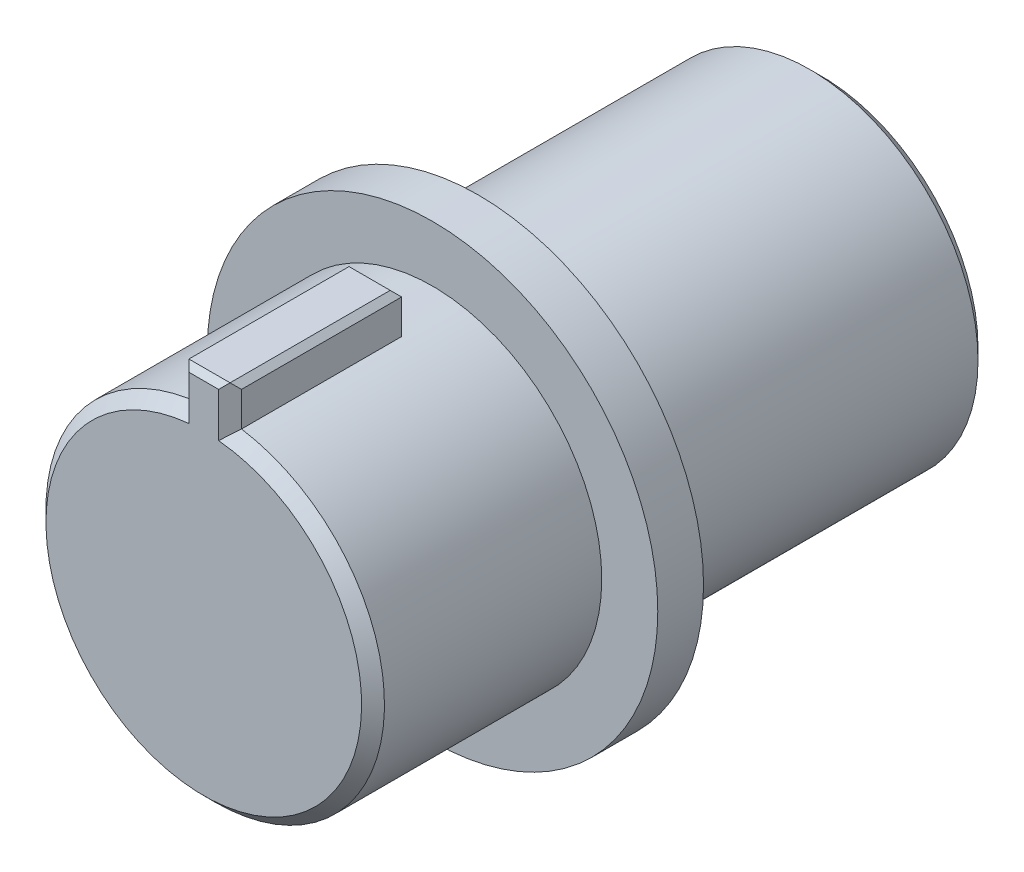
ISO-10303-21;
HEADER;
FILE_DESCRIPTION(('STEP AP214'),'2;1');
FILE_NAME('part.step','',(''),(''),'','','');
FILE_SCHEMA(('AUTOMOTIVE_DESIGN { 1 0 10303 214 1 1 1 1 }'));
ENDSEC;
DATA;
#1=APPLICATION_CONTEXT('core data for automotive mechanical design processes');
#2=APPLICATION_PROTOCOL_DEFINITION('international standard','automotive_design',2000,#1);
#3=PRODUCT_CONTEXT('',#1,'mechanical');
#4=PRODUCT('Part','Part','',(#3));
#5=PRODUCT_RELATED_PRODUCT_CATEGORY('part','',(#4));
#6=PRODUCT_DEFINITION_FORMATION('','',#4);
#7=PRODUCT_DEFINITION_CONTEXT('part definition',#1,'design');
#8=PRODUCT_DEFINITION('design','',#6,#7);
#9=PRODUCT_DEFINITION_SHAPE('','',#8);
#10=(LENGTH_UNIT() NAMED_UNIT(*) SI_UNIT(.MILLI.,.METRE.));
#11=(NAMED_UNIT(*) PLANE_ANGLE_UNIT() SI_UNIT($,.RADIAN.));
#12=(NAMED_UNIT(*) SI_UNIT($,.STERADIAN.) SOLID_ANGLE_UNIT());
#13=UNCERTAINTY_MEASURE_WITH_UNIT(LENGTH_MEASURE(1.E-05),#10,'distance_accuracy_value','');
#14=(GEOMETRIC_REPRESENTATION_CONTEXT(3) GLOBAL_UNCERTAINTY_ASSIGNED_CONTEXT((#13)) GLOBAL_UNIT_ASSIGNED_CONTEXT((#10,
#11,#12)) REPRESENTATION_CONTEXT('',''));
#15=CARTESIAN_POINT('',(0.,0.,0.));
#16=DIRECTION('',(0.,0.,1.));
#17=DIRECTION('',(1.,0.,0.));
#18=AXIS2_PLACEMENT_3D('',#15,#16,#17);
#19=CARTESIAN_POINT('',(-49.9999999999998,10.3000000000004,-30.));
#20=DIRECTION('',(0.,0.,1.));
#21=DIRECTION('',(1.,0.,0.));
#22=AXIS2_PLACEMENT_3D('',#19,#20,#21);
#23=CYLINDRICAL_SURFACE('',#22,14.7);
#24=CARTESIAN_POINT('',(-49.9999999999998,10.3000000000004,-29.));
#25=DIRECTION('',(0.,0.,1.));
#26=DIRECTION('',(1.,0.,0.));
#27=AXIS2_PLACEMENT_3D('',#24,#25,#26);
#28=CIRCLE('',#27,14.7);
#29=CARTESIAN_POINT('',(-35.2999999999998,10.3000000000004,-29.));
#30=VERTEX_POINT('',#29);
#31=EDGE_CURVE('E56',#30,#30,#28,.T.);
#32=ORIENTED_EDGE('',*,*,#31,.T.);
#33=EDGE_LOOP('',(#32));
#34=FACE_BOUND('',#33,.T.);
#35=CARTESIAN_POINT('',(-49.9999999999998,10.3000000000004,0.));
#36=DIRECTION('',(0.,0.,1.));
#37=DIRECTION('',(1.,0.,0.));
#38=AXIS2_PLACEMENT_3D('',#35,#36,#37);
#39=CIRCLE('',#38,14.7);
#40=CARTESIAN_POINT('',(-35.2999999999998,10.3000000000004,0.));
#41=VERTEX_POINT('',#40);
#42=EDGE_CURVE('E157',#41,#41,#39,.T.);
#43=ORIENTED_EDGE('',*,*,#42,.F.);
#44=EDGE_LOOP('',(#43));
#45=FACE_BOUND('',#44,.T.);
#46=ADVANCED_FACE('F40',(#34,#45),#23,.T.);
#47=CARTESIAN_POINT('',(-49.9999999999998,10.3000000000004,-30.));
#48=DIRECTION('',(0.,0.,1.));
#49=DIRECTION('',(1.,0.,0.));
#50=AXIS2_PLACEMENT_3D('',#47,#48,#49);
#51=PLANE('',#50);
#52=CARTESIAN_POINT('',(-49.9999999999998,10.3000000000004,-30.));
#53=DIRECTION('',(0.,0.,1.));
#54=DIRECTION('',(1.,0.,0.));
#55=AXIS2_PLACEMENT_3D('',#52,#53,#54);
#56=CIRCLE('',#55,13.7);
#57=CARTESIAN_POINT('',(-36.2999999999998,10.3000000000004,-30.));
#58=VERTEX_POINT('',#57);
#59=EDGE_CURVE('E11',#58,#58,#56,.F.);
#60=ORIENTED_EDGE('',*,*,#59,.T.);
#61=EDGE_LOOP('',(#60));
#62=FACE_BOUND('',#61,.T.);
#63=ADVANCED_FACE('F264',(#62),#51,.F.);
#64=CARTESIAN_POINT('',(-49.9999999999998,10.3000000000004,4.));
#65=DIRECTION('',(0.,0.,-1.));
#66=DIRECTION('',(-1.,0.,0.));
#67=AXIS2_PLACEMENT_3D('',#64,#65,#66);
#68=CYLINDRICAL_SURFACE('',#67,19.7);
#69=CARTESIAN_POINT('',(-49.9999999999998,10.3000000000004,4.));
#70=DIRECTION('',(0.,0.,1.));
#71=DIRECTION('',(1.,0.,0.));
#72=AXIS2_PLACEMENT_3D('',#69,#70,#71);
#73=CIRCLE('',#72,19.7);
#74=CARTESIAN_POINT('',(-30.2999999999998,10.3000000000004,4.));
#75=VERTEX_POINT('',#74);
#76=EDGE_CURVE('E158',#75,#75,#73,.T.);
#77=ORIENTED_EDGE('',*,*,#76,.F.);
#78=EDGE_LOOP('',(#77));
#79=FACE_BOUND('',#78,.T.);
#80=CARTESIAN_POINT('',(-49.9999999999998,10.3000000000004,0.));
#81=DIRECTION('',(0.,0.,1.));
#82=DIRECTION('',(1.,0.,0.));
#83=AXIS2_PLACEMENT_3D('',#80,#81,#82);
#84=CIRCLE('',#83,19.7);
#85=CARTESIAN_POINT('',(-30.2999999999998,10.3000000000004,0.));
#86=VERTEX_POINT('',#85);
#87=EDGE_CURVE('E150',#86,#86,#84,.T.);
#88=ORIENTED_EDGE('',*,*,#87,.T.);
#89=EDGE_LOOP('',(#88));
#90=FACE_BOUND('',#89,.T.);
#91=ADVANCED_FACE('F271',(#79,#90),#68,.T.);
#92=CARTESIAN_POINT('',(-49.9999999999998,10.3000000000004,4.));
#93=DIRECTION('',(0.,0.,1.));
#94=DIRECTION('',(1.,0.,0.));
#95=AXIS2_PLACEMENT_3D('',#92,#93,#94);
#96=PLANE('',#95);
#97=CARTESIAN_POINT('',(-49.9999999999998,10.3000000000004,4.));
#98=DIRECTION('',(0.,0.,1.));
#99=DIRECTION('',(1.,0.,0.));
#100=AXIS2_PLACEMENT_3D('',#97,#98,#99);
#101=CIRCLE('',#100,14.8);
#102=CARTESIAN_POINT('',(-35.1999999999998,10.3000000000004,4.));
#103=VERTEX_POINT('',#102);
#104=EDGE_CURVE('E152',#103,#103,#101,.T.);
#105=ORIENTED_EDGE('',*,*,#104,.F.);
#106=EDGE_LOOP('',(#105));
#107=FACE_BOUND('',#106,.T.);
#108=ORIENTED_EDGE('',*,*,#76,.T.);
#109=EDGE_LOOP('',(#108));
#110=FACE_BOUND('',#109,.T.);
#111=ADVANCED_FACE('F337',(#107,#110),#96,.T.);
#112=CARTESIAN_POINT('',(-49.9999999999998,10.3000000000004,0.));
#113=DIRECTION('',(0.,0.,1.));
#114=DIRECTION('',(1.,0.,0.));
#115=AXIS2_PLACEMENT_3D('',#112,#113,#114);
#116=PLANE('',#115);
#117=ORIENTED_EDGE('',*,*,#42,.T.);
#118=EDGE_LOOP('',(#117));
#119=FACE_BOUND('',#118,.T.);
#120=ORIENTED_EDGE('',*,*,#87,.F.);
#121=EDGE_LOOP('',(#120));
#122=FACE_BOUND('',#121,.T.);
#123=ADVANCED_FACE('F336',(#119,#122),#116,.F.);
#124=CARTESIAN_POINT('',(-49.9999999999998,10.3000000000004,24.));
#125=DIRECTION('',(0.,0.,-1.));
#126=DIRECTION('',(-1.,0.,0.));
#127=AXIS2_PLACEMENT_3D('',#124,#125,#126);
#128=CYLINDRICAL_SURFACE('',#127,14.8);
#129=DIRECTION('',(0.,0.,1.));
#130=VECTOR('',#129,1.);
#131=CARTESIAN_POINT('',(-47.6999999999998,24.9201915172138,9.));
#132=LINE('',#131,#130);
#133=CARTESIAN_POINT('',(-47.6999999999998,24.9201915172138,9.));
#134=VERTEX_POINT('',#133);
#135=CARTESIAN_POINT('',(-47.6999999999998,24.9201915172138,23.));
#136=VERTEX_POINT('',#135);
#137=EDGE_CURVE('E115',#134,#136,#132,.T.);
#138=ORIENTED_EDGE('',*,*,#137,.T.);
#139=CARTESIAN_POINT('',(-49.9999999999998,10.3000000000004,23.));
#140=DIRECTION('',(0.,0.,1.));
#141=DIRECTION('',(1.,0.,0.));
#142=AXIS2_PLACEMENT_3D('',#139,#140,#141);
#143=CIRCLE('',#142,14.8);
#144=CARTESIAN_POINT('',(-52.2999999999998,24.9201915172138,23.));
#145=VERTEX_POINT('',#144);
#146=EDGE_CURVE('E64',#136,#145,#143,.F.);
#147=ORIENTED_EDGE('',*,*,#146,.T.);
#148=DIRECTION('',(0.,0.,1.));
#149=VECTOR('',#148,1.);
#150=CARTESIAN_POINT('',(-52.2999999999998,24.9201915172138,9.));
#151=LINE('',#150,#149);
#152=CARTESIAN_POINT('',(-52.2999999999998,24.9201915172138,9.));
#153=VERTEX_POINT('',#152);
#154=EDGE_CURVE('E125',#153,#145,#151,.T.);
#155=ORIENTED_EDGE('',*,*,#154,.F.);
#156=CARTESIAN_POINT('',(-49.9999999999998,10.3000000000004,9.));
#157=DIRECTION('',(0.,0.,-1.));
#158=DIRECTION('',(1.,0.,0.));
#159=AXIS2_PLACEMENT_3D('',#156,#157,#158);
#160=CIRCLE('',#159,14.8);
#161=EDGE_CURVE('E132',#153,#134,#160,.T.);
#162=ORIENTED_EDGE('',*,*,#161,.T.);
#163=EDGE_LOOP('',(#138,#147,#155,#162));
#164=FACE_BOUND('',#163,.T.);
#165=ORIENTED_EDGE('',*,*,#104,.T.);
#166=EDGE_LOOP('',(#165));
#167=FACE_BOUND('',#166,.T.);
#168=ADVANCED_FACE('F137',(#164,#167),#128,.T.);
#169=CARTESIAN_POINT('',(-49.9999999999998,10.3000000000004,24.));
#170=DIRECTION('',(0.,0.,1.));
#171=DIRECTION('',(1.,0.,0.));
#172=AXIS2_PLACEMENT_3D('',#169,#170,#171);
#173=PLANE('',#172);
#174=CARTESIAN_POINT('',(-49.9999999999998,10.3000000000004,24.));
#175=DIRECTION('',(0.,0.,1.));
#176=DIRECTION('',(1.,0.,0.));
#177=AXIS2_PLACEMENT_3D('',#174,#175,#176);
#178=CIRCLE('',#177,13.8);
#179=CARTESIAN_POINT('',(-51.2999999999998,24.0386316640345,24.));
#180=VERTEX_POINT('',#179);
#181=CARTESIAN_POINT('',(-48.6999999999998,24.0386316640345,24.));
#182=VERTEX_POINT('',#181);
#183=EDGE_CURVE('E193',#180,#182,#178,.T.);
#184=ORIENTED_EDGE('',*,*,#183,.T.);
#185=DIRECTION('',(0.,1.,0.));
#186=VECTOR('',#185,1.);
#187=CARTESIAN_POINT('',(-48.6999999999998,10.3000000000004,24.));
#188=LINE('',#187,#186);
#189=CARTESIAN_POINT('',(-48.6999999999998,27.9201915172138,24.));
#190=VERTEX_POINT('',#189);
#191=EDGE_CURVE('E202',#182,#190,#188,.T.);
#192=ORIENTED_EDGE('',*,*,#191,.T.);
#193=DIRECTION('',(-1.,0.,0.));
#194=VECTOR('',#193,1.);
#195=CARTESIAN_POINT('',(-49.9999999999998,27.9201915172138,24.));
#196=LINE('',#195,#194);
#197=CARTESIAN_POINT('',(-51.2999999999998,27.9201915172138,24.));
#198=VERTEX_POINT('',#197);
#199=EDGE_CURVE('E189',#190,#198,#196,.T.);
#200=ORIENTED_EDGE('',*,*,#199,.T.);
#201=DIRECTION('',(0.,-1.,0.));
#202=VECTOR('',#201,1.);
#203=CARTESIAN_POINT('',(-51.2999999999998,10.3000000000004,24.));
#204=LINE('',#203,#202);
#205=EDGE_CURVE('E199',#198,#180,#204,.T.);
#206=ORIENTED_EDGE('',*,*,#205,.T.);
#207=EDGE_LOOP('',(#184,#192,#200,#206));
#208=FACE_BOUND('',#207,.T.);
#209=ADVANCED_FACE('F323',(#208),#173,.T.);
#210=CARTESIAN_POINT('',(-52.2999999999998,24.9201915172138,9.));
#211=DIRECTION('',(-1.,0.,0.));
#212=DIRECTION('',(0.,0.,1.));
#213=AXIS2_PLACEMENT_3D('',#210,#211,#212);
#214=PLANE('',#213);
#215=ORIENTED_EDGE('',*,*,#154,.T.);
#216=DIRECTION('',(0.,1.,0.));
#217=VECTOR('',#216,1.);
#218=CARTESIAN_POINT('',(-52.2999999999998,24.9201915172138,23.));
#219=LINE('',#218,#217);
#220=CARTESIAN_POINT('',(-52.2999999999998,27.9201915172138,23.));
#221=VERTEX_POINT('',#220);
#222=EDGE_CURVE('E71',#145,#221,#219,.T.);
#223=ORIENTED_EDGE('',*,*,#222,.T.);
#224=DIRECTION('',(0.,0.,-1.));
#225=VECTOR('',#224,1.);
#226=CARTESIAN_POINT('',(-52.2999999999998,27.9201915172138,9.));
#227=LINE('',#226,#225);
#228=CARTESIAN_POINT('',(-52.2999999999998,27.9201915172138,9.));
#229=VERTEX_POINT('',#228);
#230=EDGE_CURVE('E181',#221,#229,#227,.T.);
#231=ORIENTED_EDGE('',*,*,#230,.T.);
#232=DIRECTION('',(0.,-1.,0.));
#233=VECTOR('',#232,1.);
#234=CARTESIAN_POINT('',(-52.2999999999998,24.9201915172138,9.));
#235=LINE('',#234,#233);
#236=EDGE_CURVE('E126',#229,#153,#235,.T.);
#237=ORIENTED_EDGE('',*,*,#236,.T.);
#238=EDGE_LOOP('',(#215,#223,#231,#237));
#239=FACE_BOUND('',#238,.T.);
#240=ADVANCED_FACE('F321',(#239),#214,.T.);
#241=CARTESIAN_POINT('',(-52.2999999999998,28.4201915172138,9.));
#242=DIRECTION('',(0.,1.,0.));
#243=DIRECTION('',(0.,0.,1.));
#244=AXIS2_PLACEMENT_3D('',#241,#242,#243);
#245=PLANE('',#244);
#246=DIRECTION('',(-1.,0.,0.));
#247=VECTOR('',#246,1.);
#248=CARTESIAN_POINT('',(-52.2999999999998,28.4201915172138,9.5));
#249=LINE('',#248,#247);
#250=CARTESIAN_POINT('',(-48.1999999999998,28.4201915172138,9.5));
#251=VERTEX_POINT('',#250);
#252=CARTESIAN_POINT('',(-51.7999999999998,28.4201915172138,9.5));
#253=VERTEX_POINT('',#252);
#254=EDGE_CURVE('E174',#251,#253,#249,.T.);
#255=ORIENTED_EDGE('',*,*,#254,.T.);
#256=DIRECTION('',(0.,0.,1.));
#257=VECTOR('',#256,1.);
#258=CARTESIAN_POINT('',(-51.7999999999998,28.4201915172138,9.));
#259=LINE('',#258,#257);
#260=CARTESIAN_POINT('',(-51.7999999999998,28.4201915172138,23.5));
#261=VERTEX_POINT('',#260);
#262=EDGE_CURVE('E177',#253,#261,#259,.T.);
#263=ORIENTED_EDGE('',*,*,#262,.T.);
#264=DIRECTION('',(1.,0.,0.));
#265=VECTOR('',#264,1.);
#266=CARTESIAN_POINT('',(-52.2999999999998,28.4201915172138,23.5));
#267=LINE('',#266,#265);
#268=CARTESIAN_POINT('',(-48.1999999999998,28.4201915172138,23.5));
#269=VERTEX_POINT('',#268);
#270=EDGE_CURVE('E156',#261,#269,#267,.T.);
#271=ORIENTED_EDGE('',*,*,#270,.T.);
#272=DIRECTION('',(0.,0.,-1.));
#273=VECTOR('',#272,1.);
#274=CARTESIAN_POINT('',(-48.1999999999998,28.4201915172138,9.));
#275=LINE('',#274,#273);
#276=EDGE_CURVE('E171',#269,#251,#275,.T.);
#277=ORIENTED_EDGE('',*,*,#276,.T.);
#278=EDGE_LOOP('',(#255,#263,#271,#277));
#279=FACE_BOUND('',#278,.T.);
#280=ADVANCED_FACE('F319',(#279),#245,.T.);
#281=CARTESIAN_POINT('',(-47.6999999999998,24.9201915172138,9.));
#282=DIRECTION('',(1.,0.,0.));
#283=DIRECTION('',(0.,1.,0.));
#284=AXIS2_PLACEMENT_3D('',#281,#282,#283);
#285=PLANE('',#284);
#286=DIRECTION('',(0.,0.,1.));
#287=VECTOR('',#286,1.);
#288=CARTESIAN_POINT('',(-47.6999999999998,27.9201915172138,9.));
#289=LINE('',#288,#287);
#290=CARTESIAN_POINT('',(-47.6999999999998,27.9201915172138,9.));
#291=VERTEX_POINT('',#290);
#292=CARTESIAN_POINT('',(-47.6999999999998,27.9201915172138,23.));
#293=VERTEX_POINT('',#292);
#294=EDGE_CURVE('E186',#291,#293,#289,.T.);
#295=ORIENTED_EDGE('',*,*,#294,.T.);
#296=DIRECTION('',(0.,-1.,0.));
#297=VECTOR('',#296,1.);
#298=CARTESIAN_POINT('',(-47.6999999999998,24.9201915172138,23.));
#299=LINE('',#298,#297);
#300=EDGE_CURVE('E122',#293,#136,#299,.T.);
#301=ORIENTED_EDGE('',*,*,#300,.T.);
#302=ORIENTED_EDGE('',*,*,#137,.F.);
#303=DIRECTION('',(0.,1.,0.));
#304=VECTOR('',#303,1.);
#305=CARTESIAN_POINT('',(-47.6999999999998,24.9201915172138,9.));
#306=LINE('',#305,#304);
#307=EDGE_CURVE('E119',#134,#291,#306,.T.);
#308=ORIENTED_EDGE('',*,*,#307,.T.);
#309=EDGE_LOOP('',(#295,#301,#302,#308));
#310=FACE_BOUND('',#309,.T.);
#311=ADVANCED_FACE('F118',(#310),#285,.T.);
#312=CARTESIAN_POINT('',(-49.9999999999998,10.3000000000004,9.));
#313=DIRECTION('',(0.,0.,1.));
#314=DIRECTION('',(1.,0.,0.));
#315=AXIS2_PLACEMENT_3D('',#312,#313,#314);
#316=PLANE('',#315);
#317=ORIENTED_EDGE('',*,*,#236,.F.);
#318=DIRECTION('',(1.,0.,0.));
#319=VECTOR('',#318,1.);
#320=CARTESIAN_POINT('',(-47.6999999999998,27.9201915172138,9.));
#321=LINE('',#320,#319);
#322=EDGE_CURVE('E134',#229,#291,#321,.T.);
#323=ORIENTED_EDGE('',*,*,#322,.T.);
#324=ORIENTED_EDGE('',*,*,#307,.F.);
#325=ORIENTED_EDGE('',*,*,#161,.F.);
#326=EDGE_LOOP('',(#317,#323,#324,#325));
#327=FACE_BOUND('',#326,.T.);
#328=ADVANCED_FACE('F131',(#327),#316,.F.);
#329=CARTESIAN_POINT('',(-47.6999999999998,27.9201915172138,9.));
#330=DIRECTION('',(-0.707106781186543,-0.707106781186552,0.));
#331=DIRECTION('',(0.,0.,1.));
#332=AXIS2_PLACEMENT_3D('',#329,#330,#331);
#333=PLANE('',#332);
#334=ORIENTED_EDGE('',*,*,#276,.F.);
#335=DIRECTION('',(0.577350269189629,-0.577350269189621,-0.577350269189627));
#336=VECTOR('',#335,1.);
#337=CARTESIAN_POINT('',(-43.0333333333331,23.2535248505472,18.3333333333333));
#338=LINE('',#337,#336);
#339=EDGE_CURVE('E212',#269,#293,#338,.T.);
#340=ORIENTED_EDGE('',*,*,#339,.T.);
#341=ORIENTED_EDGE('',*,*,#294,.F.);
#342=DIRECTION('',(0.577350269189628,-0.57735026918962,-0.577350269189628));
#343=VECTOR('',#342,1.);
#344=CARTESIAN_POINT('',(-47.6999999999998,27.9201915172138,9.));
#345=LINE('',#344,#343);
#346=EDGE_CURVE('E140',#251,#291,#345,.T.);
#347=ORIENTED_EDGE('',*,*,#346,.F.);
#348=EDGE_LOOP('',(#334,#340,#341,#347));
#349=FACE_BOUND('',#348,.T.);
#350=ADVANCED_FACE('F291',(#349),#333,.F.);
#351=CARTESIAN_POINT('',(-52.2999999999998,28.4201915172138,9.5));
#352=DIRECTION('',(0.,0.707106781186552,-0.707106781186543));
#353=DIRECTION('',(1.,0.,0.));
#354=AXIS2_PLACEMENT_3D('',#351,#352,#353);
#355=PLANE('',#354);
#356=ORIENTED_EDGE('',*,*,#346,.T.);
#357=ORIENTED_EDGE('',*,*,#322,.F.);
#358=DIRECTION('',(-0.577350269189628,-0.57735026918962,-0.577350269189628));
#359=VECTOR('',#358,1.);
#360=CARTESIAN_POINT('',(-51.9666666666665,28.2535248505472,9.33333333333333));
#361=LINE('',#360,#359);
#362=EDGE_CURVE('E144',#253,#229,#361,.T.);
#363=ORIENTED_EDGE('',*,*,#362,.F.);
#364=ORIENTED_EDGE('',*,*,#254,.F.);
#365=EDGE_LOOP('',(#356,#357,#363,#364));
#366=FACE_BOUND('',#365,.T.);
#367=ADVANCED_FACE('F285',(#366),#355,.T.);
#368=CARTESIAN_POINT('',(-49.9999999999998,27.9201915172138,24.));
#369=DIRECTION('',(0.,-0.707106781186552,-0.707106781186543));
#370=DIRECTION('',(-1.,0.,0.));
#371=AXIS2_PLACEMENT_3D('',#368,#369,#370);
#372=PLANE('',#371);
#373=ORIENTED_EDGE('',*,*,#199,.F.);
#374=DIRECTION('',(0.577350269189631,0.577350269189619,-0.577350269189627));
#375=VECTOR('',#374,1.);
#376=CARTESIAN_POINT('',(-49.1333333333331,27.4868581838805,24.4333333333333));
#377=LINE('',#376,#375);
#378=EDGE_CURVE('E209',#190,#269,#377,.T.);
#379=ORIENTED_EDGE('',*,*,#378,.T.);
#380=ORIENTED_EDGE('',*,*,#270,.F.);
#381=DIRECTION('',(0.577350269189631,-0.577350269189619,0.577350269189627));
#382=VECTOR('',#381,1.);
#383=CARTESIAN_POINT('',(-50.8666666666665,27.4868581838805,24.4333333333333));
#384=LINE('',#383,#382);
#385=EDGE_CURVE('E206',#261,#198,#384,.T.);
#386=ORIENTED_EDGE('',*,*,#385,.T.);
#387=EDGE_LOOP('',(#373,#379,#380,#386));
#388=FACE_BOUND('',#387,.T.);
#389=ADVANCED_FACE('F259',(#388),#372,.F.);
#390=CARTESIAN_POINT('',(-51.7999999999998,28.4201915172138,9.));
#391=DIRECTION('',(0.707106781186543,-0.707106781186552,0.));
#392=DIRECTION('',(0.,0.,1.));
#393=AXIS2_PLACEMENT_3D('',#390,#391,#392);
#394=PLANE('',#393);
#395=ORIENTED_EDGE('',*,*,#230,.F.);
#396=DIRECTION('',(0.57735026918963,0.577350269189622,0.577350269189626));
#397=VECTOR('',#396,1.);
#398=CARTESIAN_POINT('',(-56.6333333333332,23.5868581838805,18.6666666666667));
#399=LINE('',#398,#397);
#400=EDGE_CURVE('E219',#221,#261,#399,.T.);
#401=ORIENTED_EDGE('',*,*,#400,.T.);
#402=ORIENTED_EDGE('',*,*,#262,.F.);
#403=ORIENTED_EDGE('',*,*,#362,.T.);
#404=EDGE_LOOP('',(#395,#401,#402,#403));
#405=FACE_BOUND('',#404,.T.);
#406=ADVANCED_FACE('F253',(#405),#394,.F.);
#407=CARTESIAN_POINT('',(-51.2999999999998,10.3000000000004,24.));
#408=DIRECTION('',(0.707106781186545,0.,-0.70710678118655));
#409=DIRECTION('',(0.,-1.,0.));
#410=AXIS2_PLACEMENT_3D('',#407,#408,#409);
#411=PLANE('',#410);
#412=ORIENTED_EDGE('',*,*,#400,.F.);
#413=ORIENTED_EDGE('',*,*,#222,.F.);
#414=CARTESIAN_POINT('',(-51.2999999999998,24.0386316640345,24.));
#415=CARTESIAN_POINT('',(-51.3825884808715,24.1137738775932,23.9174115191283));
#416=CARTESIAN_POINT('',(-51.4653749312714,24.1884804376042,23.8346250687285));
#417=CARTESIAN_POINT('',(-51.631322739818,24.3370434349476,23.6686772601818));
#418=CARTESIAN_POINT('',(-51.7144840795182,24.4108999134864,23.5855159204816));
#419=CARTESIAN_POINT('',(-51.881168327526,24.5577909331543,23.4188316724738));
#420=CARTESIAN_POINT('',(-51.9646912343055,24.6308254777522,23.3353087656943));
#421=CARTESIAN_POINT('',(-52.132087578406,24.7760997423685,23.1679124215939));
#422=CARTESIAN_POINT('',(-52.2159610325929,24.8483394235216,23.0840389674069));
#423=CARTESIAN_POINT('',(-52.2999999999997,24.9201915172139,23.0000000000001));
#424=B_SPLINE_CURVE_WITH_KNOTS('',3,(#414,#415,#416,#417,#418,#419,#420,#421,#422,#423),
.UNSPECIFIED.,.F.,.F.,(4,2,2,2,4),(0.,0.416643113380771,0.833265944767827,1.24988701714222,
1.66652837071146),.UNSPECIFIED.);
#425=EDGE_CURVE('E45',#180,#145,#424,.T.);
#426=ORIENTED_EDGE('',*,*,#425,.F.);
#427=ORIENTED_EDGE('',*,*,#205,.F.);
#428=ORIENTED_EDGE('',*,*,#385,.F.);
#429=EDGE_LOOP('',(#412,#413,#426,#427,#428));
#430=FACE_BOUND('',#429,.T.);
#431=ADVANCED_FACE('F245',(#430),#411,.F.);
#432=CARTESIAN_POINT('',(-49.9999999999998,10.3000000000004,24.));
#433=DIRECTION('',(0.,0.,-1.));
#434=DIRECTION('',(-1.,0.,0.));
#435=AXIS2_PLACEMENT_3D('',#432,#433,#434);
#436=CONICAL_SURFACE('',#435,13.8,0.785398163397452);
#437=ORIENTED_EDGE('',*,*,#425,.T.);
#438=ORIENTED_EDGE('',*,*,#146,.F.);
#439=CARTESIAN_POINT('',(-47.6999999999998,24.9201915172138,23.));
#440=CARTESIAN_POINT('',(-47.7840389674067,24.8483394235215,23.0840389674069));
#441=CARTESIAN_POINT('',(-47.8679124215936,24.7760997423685,23.1679124215938));
#442=CARTESIAN_POINT('',(-48.0353087656941,24.6308254777523,23.3353087656943));
#443=CARTESIAN_POINT('',(-48.1188316724736,24.5577909331543,23.4188316724738));
#444=CARTESIAN_POINT('',(-48.2855159204814,24.4108999134864,23.5855159204816));
#445=CARTESIAN_POINT('',(-48.3686772601816,24.3370434349476,23.6686772601818));
#446=CARTESIAN_POINT('',(-48.5346250687283,24.1884804376042,23.8346250687285));
#447=CARTESIAN_POINT('',(-48.6174115191281,24.1137738775932,23.9174115191283));
#448=CARTESIAN_POINT('',(-48.6999999999998,24.0386316640345,24.));
#449=B_SPLINE_CURVE_WITH_KNOTS('',3,(#439,#440,#441,#442,#443,#444,#445,#446,#447,#448),
.UNSPECIFIED.,.F.,.F.,(4,2,2,2,4),(0.,0.416641353569239,0.83326242594363,1.24988525733069,
1.66652837071146),.UNSPECIFIED.);
#450=EDGE_CURVE('E226',#182,#136,#449,.F.);
#451=ORIENTED_EDGE('',*,*,#450,.F.);
#452=ORIENTED_EDGE('',*,*,#183,.F.);
#453=EDGE_LOOP('',(#437,#438,#451,#452));
#454=FACE_BOUND('',#453,.T.);
#455=ADVANCED_FACE('F239',(#454),#436,.T.);
#456=CARTESIAN_POINT('',(-48.6999999999998,10.3000000000004,24.));
#457=DIRECTION('',(-0.707106781186546,0.,-0.707106781186549));
#458=DIRECTION('',(0.,1.,0.));
#459=AXIS2_PLACEMENT_3D('',#456,#457,#458);
#460=PLANE('',#459);
#461=ORIENTED_EDGE('',*,*,#450,.T.);
#462=ORIENTED_EDGE('',*,*,#300,.F.);
#463=ORIENTED_EDGE('',*,*,#339,.F.);
#464=ORIENTED_EDGE('',*,*,#378,.F.);
#465=ORIENTED_EDGE('',*,*,#191,.F.);
#466=EDGE_LOOP('',(#461,#462,#463,#464,#465));
#467=FACE_BOUND('',#466,.T.);
#468=ADVANCED_FACE('F235',(#467),#460,.F.);
#469=CARTESIAN_POINT('',(-49.9999999999998,10.3000000000004,-29.));
#470=DIRECTION('',(0.,0.,1.));
#471=DIRECTION('',(1.,0.,0.));
#472=AXIS2_PLACEMENT_3D('',#469,#470,#471);
#473=CONICAL_SURFACE('',#472,14.7,0.785398163397451);
#474=ORIENTED_EDGE('',*,*,#59,.F.);
#475=EDGE_LOOP('',(#474));
#476=FACE_BOUND('',#475,.T.);
#477=ORIENTED_EDGE('',*,*,#31,.F.);
#478=EDGE_LOOP('',(#477));
#479=FACE_BOUND('',#478,.T.);
#480=ADVANCED_FACE('F43',(#476,#479),#473,.T.);
#481=CLOSED_SHELL('',(#46,#63,#91,#111,#123,#168,#209,#240,#280,#311,#328,#350,#367,#389,#406,
#431,#455,#468,#480));
#482=MANIFOLD_SOLID_BREP('B2',#481);
#483=ADVANCED_BREP_SHAPE_REPRESENTATION('',(#18,#482),#14);
#484=SHAPE_DEFINITION_REPRESENTATION(#9,#483);
ENDSEC;
END-ISO-10303-21;
